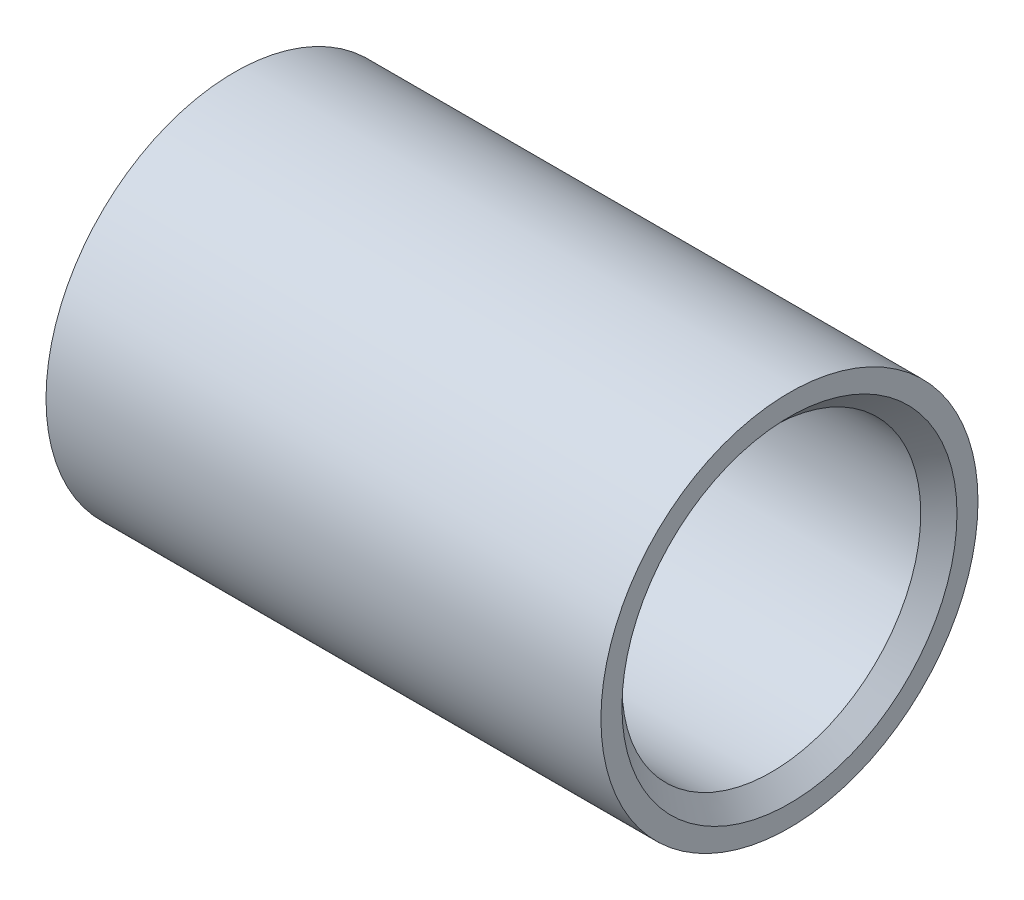
ISO-10303-21;
HEADER;
FILE_DESCRIPTION(('STEP AP214'),'2;1');
FILE_NAME('part.step','',(''),(''),'','','');
FILE_SCHEMA(('AUTOMOTIVE_DESIGN { 1 0 10303 214 1 1 1 1 }'));
ENDSEC;
DATA;
#1=APPLICATION_CONTEXT('core data for automotive mechanical design processes');
#2=APPLICATION_PROTOCOL_DEFINITION('international standard','automotive_design',2000,#1);
#3=PRODUCT_CONTEXT('',#1,'mechanical');
#4=PRODUCT('Part','Part','',(#3));
#5=PRODUCT_RELATED_PRODUCT_CATEGORY('part','',(#4));
#6=PRODUCT_DEFINITION_FORMATION('','',#4);
#7=PRODUCT_DEFINITION_CONTEXT('part definition',#1,'design');
#8=PRODUCT_DEFINITION('design','',#6,#7);
#9=PRODUCT_DEFINITION_SHAPE('','',#8);
#10=(LENGTH_UNIT() NAMED_UNIT(*) SI_UNIT(.MILLI.,.METRE.));
#11=(NAMED_UNIT(*) PLANE_ANGLE_UNIT() SI_UNIT($,.RADIAN.));
#12=(NAMED_UNIT(*) SI_UNIT($,.STERADIAN.) SOLID_ANGLE_UNIT());
#13=UNCERTAINTY_MEASURE_WITH_UNIT(LENGTH_MEASURE(1.E-05),#10,'distance_accuracy_value','');
#14=(GEOMETRIC_REPRESENTATION_CONTEXT(3) GLOBAL_UNCERTAINTY_ASSIGNED_CONTEXT((#13)) GLOBAL_UNIT_ASSIGNED_CONTEXT((#10,
#11,#12)) REPRESENTATION_CONTEXT('',''));
#15=CARTESIAN_POINT('',(0.,0.,0.));
#16=DIRECTION('',(0.,0.,1.));
#17=DIRECTION('',(1.,0.,0.));
#18=AXIS2_PLACEMENT_3D('',#15,#16,#17);
#19=CARTESIAN_POINT('',(0.,11.962,0.));
#20=DIRECTION('',(1.,0.,0.));
#21=DIRECTION('',(0.,0.,-1.));
#22=AXIS2_PLACEMENT_3D('',#19,#20,#21);
#23=PLANE('',#22);
#24=CARTESIAN_POINT('',(0.,0.,0.));
#25=DIRECTION('',(-1.,0.,0.));
#26=DIRECTION('',(0.,0.,1.));
#27=AXIS2_PLACEMENT_3D('',#24,#25,#26);
#28=CIRCLE('',#27,11.962);
#29=CARTESIAN_POINT('',(0.,0.,11.962));
#30=VERTEX_POINT('',#29);
#31=EDGE_CURVE('E52',#30,#30,#28,.T.);
#32=ORIENTED_EDGE('',*,*,#31,.F.);
#33=EDGE_LOOP('',(#32));
#34=FACE_BOUND('',#33,.T.);
#35=CARTESIAN_POINT('',(0.,0.,0.));
#36=DIRECTION('',(-1.,0.,0.));
#37=DIRECTION('',(0.,0.,1.));
#38=AXIS2_PLACEMENT_3D('',#35,#36,#37);
#39=CIRCLE('',#38,13.462);
#40=CARTESIAN_POINT('',(0.,0.,13.462));
#41=VERTEX_POINT('',#40);
#42=EDGE_CURVE('E10',#41,#41,#39,.T.);
#43=ORIENTED_EDGE('',*,*,#42,.T.);
#44=EDGE_LOOP('',(#43));
#45=FACE_BOUND('',#44,.T.);
#46=ADVANCED_FACE('F30',(#34,#45),#23,.F.);
#47=CARTESIAN_POINT('',(0.,0.,0.));
#48=DIRECTION('',(-1.,0.,0.));
#49=DIRECTION('',(0.,0.,1.));
#50=AXIS2_PLACEMENT_3D('',#47,#48,#49);
#51=CYLINDRICAL_SURFACE('',#50,13.462);
#52=ORIENTED_EDGE('',*,*,#42,.F.);
#53=EDGE_LOOP('',(#52));
#54=FACE_BOUND('',#53,.T.);
#55=CARTESIAN_POINT('',(39.624,0.,0.));
#56=DIRECTION('',(-1.,0.,0.));
#57=DIRECTION('',(0.,0.,1.));
#58=AXIS2_PLACEMENT_3D('',#55,#56,#57);
#59=CIRCLE('',#58,13.462);
#60=CARTESIAN_POINT('',(39.624,0.,13.462));
#61=VERTEX_POINT('',#60);
#62=EDGE_CURVE('E36',#61,#61,#59,.T.);
#63=ORIENTED_EDGE('',*,*,#62,.T.);
#64=EDGE_LOOP('',(#63));
#65=FACE_BOUND('',#64,.T.);
#66=ADVANCED_FACE('F59',(#54,#65),#51,.T.);
#67=CARTESIAN_POINT('',(39.624,13.462,0.));
#68=DIRECTION('',(-1.,0.,0.));
#69=DIRECTION('',(0.,0.,1.));
#70=AXIS2_PLACEMENT_3D('',#67,#68,#69);
#71=PLANE('',#70);
#72=ORIENTED_EDGE('',*,*,#62,.F.);
#73=EDGE_LOOP('',(#72));
#74=FACE_BOUND('',#73,.T.);
#75=CARTESIAN_POINT('',(39.624,0.,0.));
#76=DIRECTION('',(-1.,0.,0.));
#77=DIRECTION('',(0.,0.,1.));
#78=AXIS2_PLACEMENT_3D('',#75,#76,#77);
#79=CIRCLE('',#78,11.962);
#80=CARTESIAN_POINT('',(39.624,0.,11.962));
#81=VERTEX_POINT('',#80);
#82=EDGE_CURVE('E40',#81,#81,#79,.T.);
#83=ORIENTED_EDGE('',*,*,#82,.T.);
#84=EDGE_LOOP('',(#83));
#85=FACE_BOUND('',#84,.T.);
#86=ADVANCED_FACE('F63',(#74,#85),#71,.F.);
#87=CARTESIAN_POINT('',(38.33,0.,0.));
#88=DIRECTION('',(1.,0.,0.));
#89=DIRECTION('',(0.,0.,-1.));
#90=AXIS2_PLACEMENT_3D('',#87,#88,#89);
#91=CONICAL_SURFACE('',#90,10.668,0.78539816339744);
#92=ORIENTED_EDGE('',*,*,#82,.F.);
#93=EDGE_LOOP('',(#92));
#94=FACE_BOUND('',#93,.T.);
#95=CARTESIAN_POINT('',(38.33,0.,0.));
#96=DIRECTION('',(-1.,0.,0.));
#97=DIRECTION('',(0.,0.,1.));
#98=AXIS2_PLACEMENT_3D('',#95,#96,#97);
#99=CIRCLE('',#98,10.668);
#100=CARTESIAN_POINT('',(38.33,0.,10.668));
#101=VERTEX_POINT('',#100);
#102=EDGE_CURVE('E44',#101,#101,#99,.T.);
#103=ORIENTED_EDGE('',*,*,#102,.T.);
#104=EDGE_LOOP('',(#103));
#105=FACE_BOUND('',#104,.T.);
#106=ADVANCED_FACE('F68',(#94,#105),#91,.F.);
#107=CARTESIAN_POINT('',(0.,0.,0.));
#108=DIRECTION('',(-1.,0.,0.));
#109=DIRECTION('',(0.,0.,1.));
#110=AXIS2_PLACEMENT_3D('',#107,#108,#109);
#111=CYLINDRICAL_SURFACE('',#110,10.668);
#112=ORIENTED_EDGE('',*,*,#102,.F.);
#113=EDGE_LOOP('',(#112));
#114=FACE_BOUND('',#113,.T.);
#115=CARTESIAN_POINT('',(1.29400000000002,0.,0.));
#116=DIRECTION('',(-1.,0.,0.));
#117=DIRECTION('',(0.,0.,1.));
#118=AXIS2_PLACEMENT_3D('',#115,#116,#117);
#119=CIRCLE('',#118,10.668);
#120=CARTESIAN_POINT('',(1.29400000000002,0.,10.668));
#121=VERTEX_POINT('',#120);
#122=EDGE_CURVE('E49',#121,#121,#119,.T.);
#123=ORIENTED_EDGE('',*,*,#122,.T.);
#124=EDGE_LOOP('',(#123));
#125=FACE_BOUND('',#124,.T.);
#126=ADVANCED_FACE('F74',(#114,#125),#111,.F.);
#127=CARTESIAN_POINT('',(0.,0.,0.));
#128=DIRECTION('',(-1.,0.,0.));
#129=DIRECTION('',(0.,0.,1.));
#130=AXIS2_PLACEMENT_3D('',#127,#128,#129);
#131=CONICAL_SURFACE('',#130,11.962,0.785398163397446);
#132=ORIENTED_EDGE('',*,*,#122,.F.);
#133=EDGE_LOOP('',(#132));
#134=FACE_BOUND('',#133,.T.);
#135=ORIENTED_EDGE('',*,*,#31,.T.);
#136=EDGE_LOOP('',(#135));
#137=FACE_BOUND('',#136,.T.);
#138=ADVANCED_FACE('F56',(#134,#137),#131,.F.);
#139=CLOSED_SHELL('',(#46,#66,#86,#106,#126,#138));
#140=MANIFOLD_SOLID_BREP('B2',#139);
#141=ADVANCED_BREP_SHAPE_REPRESENTATION('',(#18,#140),#14);
#142=SHAPE_DEFINITION_REPRESENTATION(#9,#141);
ENDSEC;
END-ISO-10303-21;
